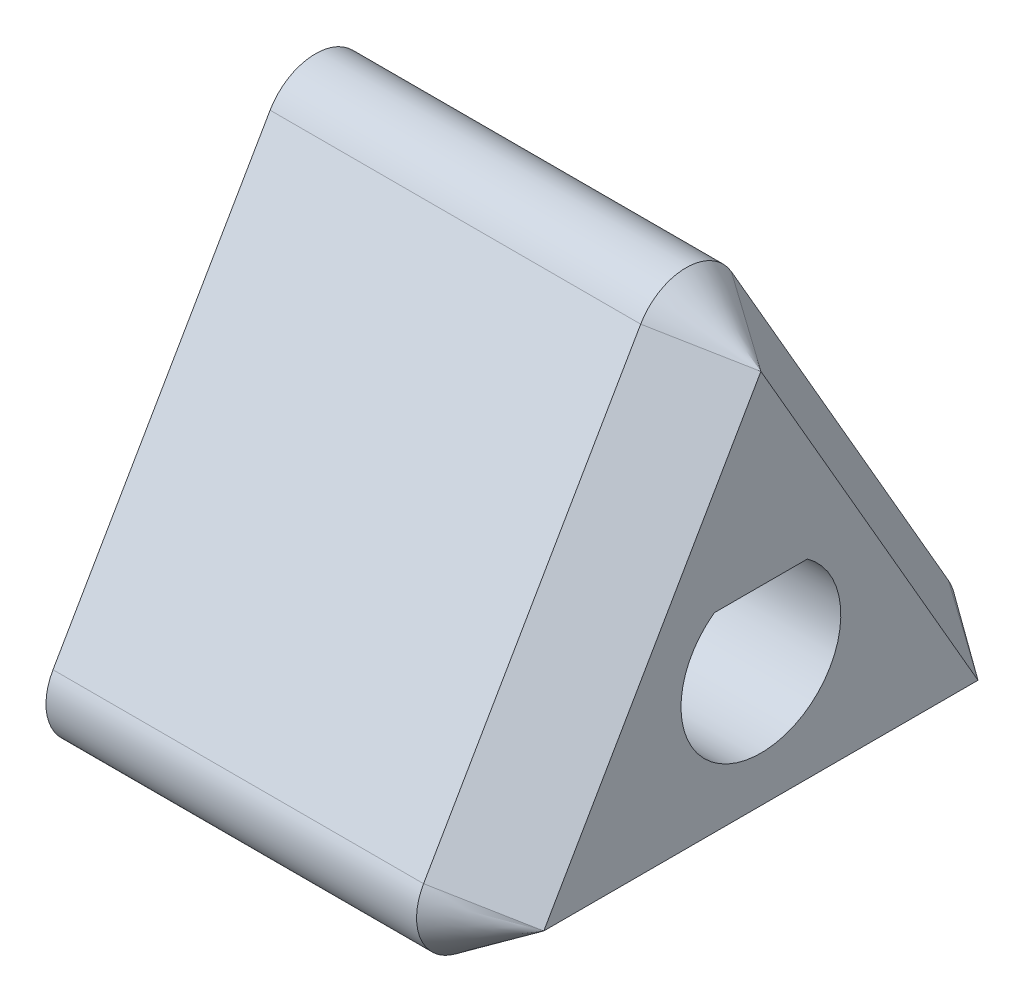
ISO-10303-21;
HEADER;
FILE_DESCRIPTION(('STEP AP214'),'2;1');
FILE_NAME('part.step','',(''),(''),'','','');
FILE_SCHEMA(('AUTOMOTIVE_DESIGN { 1 0 10303 214 1 1 1 1 }'));
ENDSEC;
DATA;
#1=APPLICATION_CONTEXT('core data for automotive mechanical design processes');
#2=APPLICATION_PROTOCOL_DEFINITION('international standard','automotive_design',2000,#1);
#3=PRODUCT_CONTEXT('',#1,'mechanical');
#4=PRODUCT('Part','Part','',(#3));
#5=PRODUCT_RELATED_PRODUCT_CATEGORY('part','',(#4));
#6=PRODUCT_DEFINITION_FORMATION('','',#4);
#7=PRODUCT_DEFINITION_CONTEXT('part definition',#1,'design');
#8=PRODUCT_DEFINITION('design','',#6,#7);
#9=PRODUCT_DEFINITION_SHAPE('','',#8);
#10=(LENGTH_UNIT() NAMED_UNIT(*) SI_UNIT(.MILLI.,.METRE.));
#11=(NAMED_UNIT(*) PLANE_ANGLE_UNIT() SI_UNIT($,.RADIAN.));
#12=(NAMED_UNIT(*) SI_UNIT($,.STERADIAN.) SOLID_ANGLE_UNIT());
#13=UNCERTAINTY_MEASURE_WITH_UNIT(LENGTH_MEASURE(1.E-05),#10,'distance_accuracy_value','');
#14=(GEOMETRIC_REPRESENTATION_CONTEXT(3) GLOBAL_UNCERTAINTY_ASSIGNED_CONTEXT((#13)) GLOBAL_UNIT_ASSIGNED_CONTEXT((#10,
#11,#12)) REPRESENTATION_CONTEXT('',''));
#15=CARTESIAN_POINT('',(0.,0.,0.));
#16=DIRECTION('',(0.,0.,1.));
#17=DIRECTION('',(1.,0.,0.));
#18=AXIS2_PLACEMENT_3D('',#15,#16,#17);
#19=CARTESIAN_POINT('',(17.,-6.78386566297798,-11.75));
#20=DIRECTION('',(0.,-0.500000000000004,0.866025403784436));
#21=DIRECTION('',(0.,-0.866025403784436,-0.500000000000004));
#22=AXIS2_PLACEMENT_3D('',#19,#20,#21);
#23=PLANE('',#22);
#24=DIRECTION('',(-1.,0.,0.));
#25=VECTOR('',#24,1.);
#26=CARTESIAN_POINT('',(17.,10.5677313259562,-1.73205080756889));
#27=LINE('',#26,#25);
#28=CARTESIAN_POINT('',(0.,10.5677313259562,-1.73205080756889));
#29=VERTEX_POINT('',#28);
#30=CARTESIAN_POINT('',(14.1437039865158,10.5677313259562,-1.73205080756889));
#31=VERTEX_POINT('',#30);
#32=EDGE_CURVE('E162',#29,#31,#27,.F.);
#33=ORIENTED_EDGE('',*,*,#32,.T.);
#34=DIRECTION('',(0.,-0.866025403784436,-0.500000000000004));
#35=VECTOR('',#34,1.);
#36=CARTESIAN_POINT('',(14.1437039865158,-3.783865662978,-10.0179491924312));
#37=LINE('',#36,#35);
#38=CARTESIAN_POINT('',(14.1437039865158,-3.783865662978,-10.0179491924312));
#39=VERTEX_POINT('',#38);
#40=EDGE_CURVE('E177',#31,#39,#37,.T.);
#41=ORIENTED_EDGE('',*,*,#40,.T.);
#42=DIRECTION('',(-1.,0.,0.));
#43=VECTOR('',#42,1.);
#44=CARTESIAN_POINT('',(17.,-3.783865662978,-10.0179491924312));
#45=LINE('',#44,#43);
#46=CARTESIAN_POINT('',(0.,-3.783865662978,-10.0179491924312));
#47=VERTEX_POINT('',#46);
#48=EDGE_CURVE('E165',#39,#47,#45,.T.);
#49=ORIENTED_EDGE('',*,*,#48,.T.);
#50=DIRECTION('',(0.,0.866025403784436,0.500000000000004));
#51=VECTOR('',#50,1.);
#52=CARTESIAN_POINT('',(0.,-6.78386566297798,-11.75));
#53=LINE('',#52,#51);
#54=EDGE_CURVE('E137',#47,#29,#53,.T.);
#55=ORIENTED_EDGE('',*,*,#54,.T.);
#56=EDGE_LOOP('',(#33,#41,#49,#55));
#57=FACE_BOUND('',#56,.T.);
#58=ADVANCED_FACE('F37',(#57),#23,.F.);
#59=CARTESIAN_POINT('',(17.,13.5677313259562,0.));
#60=DIRECTION('',(0.,-0.499999999999998,-0.86602540378444));
#61=DIRECTION('',(0.,0.86602540378444,-0.499999999999998));
#62=AXIS2_PLACEMENT_3D('',#59,#60,#61);
#63=PLANE('',#62);
#64=DIRECTION('',(-1.,0.,0.));
#65=VECTOR('',#64,1.);
#66=CARTESIAN_POINT('',(17.,-3.78386566297812,10.0179491924311));
#67=LINE('',#66,#65);
#68=CARTESIAN_POINT('',(0.,-3.78386566297813,10.0179491924311));
#69=VERTEX_POINT('',#68);
#70=CARTESIAN_POINT('',(14.1437039865158,-3.78386566297812,10.0179491924311));
#71=VERTEX_POINT('',#70);
#72=EDGE_CURVE('E160',#69,#71,#67,.F.);
#73=ORIENTED_EDGE('',*,*,#72,.T.);
#74=DIRECTION('',(0.,0.86602540378444,-0.499999999999998));
#75=VECTOR('',#74,1.);
#76=CARTESIAN_POINT('',(14.1437039865158,10.5677313259562,1.73205080756886));
#77=LINE('',#76,#75);
#78=CARTESIAN_POINT('',(14.1437039865158,10.5677313259562,1.73205080756887));
#79=VERTEX_POINT('',#78);
#80=EDGE_CURVE('E11',#71,#79,#77,.T.);
#81=ORIENTED_EDGE('',*,*,#80,.T.);
#82=DIRECTION('',(-1.,0.,0.));
#83=VECTOR('',#82,1.);
#84=CARTESIAN_POINT('',(17.,10.5677313259562,1.73205080756887));
#85=LINE('',#84,#83);
#86=CARTESIAN_POINT('',(0.,10.5677313259562,1.73205080756886));
#87=VERTEX_POINT('',#86);
#88=EDGE_CURVE('E158',#79,#87,#85,.T.);
#89=ORIENTED_EDGE('',*,*,#88,.T.);
#90=DIRECTION('',(0.,-0.86602540378444,0.499999999999998));
#91=VECTOR('',#90,1.);
#92=CARTESIAN_POINT('',(0.,13.5677313259562,0.));
#93=LINE('',#92,#91);
#94=EDGE_CURVE('E141',#87,#69,#93,.T.);
#95=ORIENTED_EDGE('',*,*,#94,.T.);
#96=EDGE_LOOP('',(#73,#81,#89,#95));
#97=FACE_BOUND('',#96,.T.);
#98=ADVANCED_FACE('F220',(#97),#63,.F.);
#99=CARTESIAN_POINT('',(17.,-6.78386566297815,11.75));
#100=DIRECTION('',(0.,1.,0.));
#101=DIRECTION('',(0.,0.,1.));
#102=AXIS2_PLACEMENT_3D('',#99,#100,#101);
#103=PLANE('',#102);
#104=DIRECTION('',(-1.,0.,0.));
#105=VECTOR('',#104,1.);
#106=CARTESIAN_POINT('',(17.,-6.78386566297801,-8.2858983848623));
#107=LINE('',#106,#105);
#108=CARTESIAN_POINT('',(0.,-6.78386566297801,-8.2858983848623));
#109=VERTEX_POINT('',#108);
#110=CARTESIAN_POINT('',(14.1437039865158,-6.78386566297801,-8.2858983848623));
#111=VERTEX_POINT('',#110);
#112=EDGE_CURVE('E147',#109,#111,#107,.F.);
#113=ORIENTED_EDGE('',*,*,#112,.T.);
#114=DIRECTION('',(0.,0.,1.));
#115=VECTOR('',#114,1.);
#116=CARTESIAN_POINT('',(14.1437039865158,-6.78386566297812,8.28589838486218));
#117=LINE('',#116,#115);
#118=CARTESIAN_POINT('',(14.1437039865158,-6.78386566297812,8.28589838486218));
#119=VERTEX_POINT('',#118);
#120=EDGE_CURVE('E179',#111,#119,#117,.T.);
#121=ORIENTED_EDGE('',*,*,#120,.T.);
#122=DIRECTION('',(-1.,0.,0.));
#123=VECTOR('',#122,1.);
#124=CARTESIAN_POINT('',(17.,-6.78386566297812,8.28589838486218));
#125=LINE('',#124,#123);
#126=CARTESIAN_POINT('',(0.,-6.78386566297812,8.28589838486218));
#127=VERTEX_POINT('',#126);
#128=EDGE_CURVE('E150',#119,#127,#125,.T.);
#129=ORIENTED_EDGE('',*,*,#128,.T.);
#130=DIRECTION('',(0.,0.,-1.));
#131=VECTOR('',#130,1.);
#132=CARTESIAN_POINT('',(0.,-6.78386566297815,11.75));
#133=LINE('',#132,#131);
#134=EDGE_CURVE('E144',#127,#109,#133,.T.);
#135=ORIENTED_EDGE('',*,*,#134,.T.);
#136=EDGE_LOOP('',(#113,#121,#129,#135));
#137=FACE_BOUND('',#136,.T.);
#138=ADVANCED_FACE('F224',(#137),#103,.F.);
#139=CARTESIAN_POINT('',(17.,0.,0.));
#140=DIRECTION('',(1.,0.,0.));
#141=DIRECTION('',(0.,0.,-1.));
#142=AXIS2_PLACEMENT_3D('',#139,#140,#141);
#143=PLANE('',#142);
#144=DIRECTION('',(0.,0.,-1.));
#145=VECTOR('',#144,1.);
#146=CARTESIAN_POINT('',(17.,-4.783865662978,-8.28589838486229));
#147=LINE('',#146,#145);
#148=CARTESIAN_POINT('',(17.,-4.78386566297812,8.28589838486219));
#149=VERTEX_POINT('',#148);
#150=CARTESIAN_POINT('',(17.,-4.783865662978,-8.28589838486229));
#151=VERTEX_POINT('',#150);
#152=EDGE_CURVE('E172',#149,#151,#147,.T.);
#153=ORIENTED_EDGE('',*,*,#152,.T.);
#154=DIRECTION('',(0.,0.866025403784437,0.500000000000004));
#155=VECTOR('',#154,1.);
#156=CARTESIAN_POINT('',(17.,9.5677313259562,0.));
#157=LINE('',#156,#155);
#158=CARTESIAN_POINT('',(17.,9.5677313259562,0.));
#159=VERTEX_POINT('',#158);
#160=EDGE_CURVE('E174',#151,#159,#157,.T.);
#161=ORIENTED_EDGE('',*,*,#160,.T.);
#162=DIRECTION('',(0.,-0.86602540378444,0.499999999999998));
#163=VECTOR('',#162,1.);
#164=CARTESIAN_POINT('',(17.,-4.78386566297813,8.28589838486219));
#165=LINE('',#164,#163);
#166=EDGE_CURVE('E170',#159,#149,#165,.T.);
#167=ORIENTED_EDGE('',*,*,#166,.T.);
#168=EDGE_LOOP('',(#153,#161,#167));
#169=FACE_BOUND('',#168,.T.);
#170=CARTESIAN_POINT('',(17.,0.,0.));
#171=DIRECTION('',(1.,0.,0.));
#172=DIRECTION('',(0.,0.,-1.));
#173=AXIS2_PLACEMENT_3D('',#170,#171,#172);
#174=CIRCLE('',#173,3.05);
#175=CARTESIAN_POINT('',(17.,2.48,1.77541544433972));
#176=VERTEX_POINT('',#175);
#177=CARTESIAN_POINT('',(17.,2.48,-1.77541544433972));
#178=VERTEX_POINT('',#177);
#179=EDGE_CURVE('E119',#176,#178,#174,.T.);
#180=ORIENTED_EDGE('',*,*,#179,.F.);
#181=DIRECTION('',(0.,0.,1.));
#182=VECTOR('',#181,1.);
#183=CARTESIAN_POINT('',(17.,2.48,-1.77541544433972));
#184=LINE('',#183,#182);
#185=EDGE_CURVE('E132',#178,#176,#184,.T.);
#186=ORIENTED_EDGE('',*,*,#185,.F.);
#187=EDGE_LOOP('',(#180,#186));
#188=FACE_BOUND('',#187,.T.);
#189=ADVANCED_FACE('F239',(#169,#188),#143,.T.);
#190=CARTESIAN_POINT('',(0.,0.,0.));
#191=DIRECTION('',(1.,0.,0.));
#192=DIRECTION('',(0.,0.,-1.));
#193=AXIS2_PLACEMENT_3D('',#190,#191,#192);
#194=PLANE('',#193);
#195=DIRECTION('',(0.,0.,1.));
#196=VECTOR('',#195,1.);
#197=CARTESIAN_POINT('',(0.,2.48,-1.77541544433972));
#198=LINE('',#197,#196);
#199=CARTESIAN_POINT('',(0.,2.48,-1.77541544433972));
#200=VERTEX_POINT('',#199);
#201=CARTESIAN_POINT('',(0.,2.48,1.77541544433972));
#202=VERTEX_POINT('',#201);
#203=EDGE_CURVE('E124',#200,#202,#198,.T.);
#204=ORIENTED_EDGE('',*,*,#203,.T.);
#205=CARTESIAN_POINT('',(0.,0.,0.));
#206=DIRECTION('',(1.,0.,0.));
#207=DIRECTION('',(0.,0.,-1.));
#208=AXIS2_PLACEMENT_3D('',#205,#206,#207);
#209=CIRCLE('',#208,3.05);
#210=EDGE_CURVE('E116',#202,#200,#209,.T.);
#211=ORIENTED_EDGE('',*,*,#210,.T.);
#212=EDGE_LOOP('',(#204,#211));
#213=FACE_BOUND('',#212,.T.);
#214=ORIENTED_EDGE('',*,*,#134,.F.);
#215=CARTESIAN_POINT('',(0.,-4.78386566297812,8.28589838486219));
#216=DIRECTION('',(1.,0.,0.));
#217=DIRECTION('',(0.,0.,-1.));
#218=AXIS2_PLACEMENT_3D('',#215,#216,#217);
#219=CIRCLE('',#218,2.);
#220=EDGE_CURVE('E156',#127,#69,#219,.F.);
#221=ORIENTED_EDGE('',*,*,#220,.T.);
#222=ORIENTED_EDGE('',*,*,#94,.F.);
#223=CARTESIAN_POINT('',(0.,9.5677313259562,0.));
#224=DIRECTION('',(1.,0.,0.));
#225=DIRECTION('',(0.,0.,-1.));
#226=AXIS2_PLACEMENT_3D('',#223,#224,#225);
#227=CIRCLE('',#226,2.);
#228=EDGE_CURVE('E152',#87,#29,#227,.F.);
#229=ORIENTED_EDGE('',*,*,#228,.T.);
#230=ORIENTED_EDGE('',*,*,#54,.F.);
#231=CARTESIAN_POINT('',(0.,-4.78386566297801,-8.28589838486229));
#232=DIRECTION('',(1.,0.,0.));
#233=DIRECTION('',(0.,0.,-1.));
#234=AXIS2_PLACEMENT_3D('',#231,#232,#233);
#235=CIRCLE('',#234,2.);
#236=EDGE_CURVE('E154',#47,#109,#235,.F.);
#237=ORIENTED_EDGE('',*,*,#236,.T.);
#238=EDGE_LOOP('',(#214,#221,#222,#229,#230,#237));
#239=FACE_BOUND('',#238,.T.);
#240=ADVANCED_FACE('F130',(#213,#239),#194,.F.);
#241=CARTESIAN_POINT('',(0.,0.,0.));
#242=DIRECTION('',(1.,0.,0.));
#243=DIRECTION('',(0.,0.,-1.));
#244=AXIS2_PLACEMENT_3D('',#241,#242,#243);
#245=CYLINDRICAL_SURFACE('',#244,3.05);
#246=ORIENTED_EDGE('',*,*,#179,.T.);
#247=DIRECTION('',(1.,0.,0.));
#248=VECTOR('',#247,1.);
#249=CARTESIAN_POINT('',(0.,2.48,-1.77541544433972));
#250=LINE('',#249,#248);
#251=EDGE_CURVE('E112',#200,#178,#250,.T.);
#252=ORIENTED_EDGE('',*,*,#251,.F.);
#253=ORIENTED_EDGE('',*,*,#210,.F.);
#254=DIRECTION('',(1.,0.,0.));
#255=VECTOR('',#254,1.);
#256=CARTESIAN_POINT('',(0.,2.48,1.77541544433972));
#257=LINE('',#256,#255);
#258=EDGE_CURVE('E123',#202,#176,#257,.T.);
#259=ORIENTED_EDGE('',*,*,#258,.T.);
#260=EDGE_LOOP('',(#246,#252,#253,#259));
#261=FACE_BOUND('',#260,.T.);
#262=ADVANCED_FACE('F114',(#261),#245,.F.);
#263=CARTESIAN_POINT('',(0.,2.48,-1.77541544433972));
#264=DIRECTION('',(0.,1.,0.));
#265=DIRECTION('',(0.,0.,1.));
#266=AXIS2_PLACEMENT_3D('',#263,#264,#265);
#267=PLANE('',#266);
#268=ORIENTED_EDGE('',*,*,#185,.T.);
#269=ORIENTED_EDGE('',*,*,#258,.F.);
#270=ORIENTED_EDGE('',*,*,#203,.F.);
#271=ORIENTED_EDGE('',*,*,#251,.T.);
#272=EDGE_LOOP('',(#268,#269,#270,#271));
#273=FACE_BOUND('',#272,.T.);
#274=ADVANCED_FACE('F127',(#273),#267,.F.);
#275=CARTESIAN_POINT('',(17.,-4.78386566297812,8.28589838486219));
#276=DIRECTION('',(-1.,0.,0.));
#277=DIRECTION('',(0.,0.,1.));
#278=AXIS2_PLACEMENT_3D('',#275,#276,#277);
#279=CYLINDRICAL_SURFACE('',#278,2.);
#280=ORIENTED_EDGE('',*,*,#128,.F.);
#281=CARTESIAN_POINT('',(14.1437039865158,-4.78386566297812,8.28589838486219));
#282=DIRECTION('',(1.,0.,0.));
#283=DIRECTION('',(0.,0.,-1.));
#284=AXIS2_PLACEMENT_3D('',#281,#282,#283);
#285=CIRCLE('',#284,2.);
#286=EDGE_CURVE('E47',#119,#71,#285,.F.);
#287=ORIENTED_EDGE('',*,*,#286,.T.);
#288=ORIENTED_EDGE('',*,*,#72,.F.);
#289=ORIENTED_EDGE('',*,*,#220,.F.);
#290=EDGE_LOOP('',(#280,#287,#288,#289));
#291=FACE_BOUND('',#290,.T.);
#292=ADVANCED_FACE('F221',(#291),#279,.T.);
#293=CARTESIAN_POINT('',(17.,-4.78386566297801,-8.28589838486229));
#294=DIRECTION('',(-1.,0.,0.));
#295=DIRECTION('',(0.,0.,1.));
#296=AXIS2_PLACEMENT_3D('',#293,#294,#295);
#297=CYLINDRICAL_SURFACE('',#296,2.);
#298=ORIENTED_EDGE('',*,*,#48,.F.);
#299=CARTESIAN_POINT('',(14.1437039865158,-4.78386566297801,-8.28589838486229));
#300=DIRECTION('',(1.,0.,0.));
#301=DIRECTION('',(0.,0.,-1.));
#302=AXIS2_PLACEMENT_3D('',#299,#300,#301);
#303=CIRCLE('',#302,2.);
#304=EDGE_CURVE('E167',#39,#111,#303,.F.);
#305=ORIENTED_EDGE('',*,*,#304,.T.);
#306=ORIENTED_EDGE('',*,*,#112,.F.);
#307=ORIENTED_EDGE('',*,*,#236,.F.);
#308=EDGE_LOOP('',(#298,#305,#306,#307));
#309=FACE_BOUND('',#308,.T.);
#310=ADVANCED_FACE('F226',(#309),#297,.T.);
#311=CARTESIAN_POINT('',(17.,9.5677313259562,0.));
#312=DIRECTION('',(-1.,0.,0.));
#313=DIRECTION('',(0.,0.,1.));
#314=AXIS2_PLACEMENT_3D('',#311,#312,#313);
#315=CYLINDRICAL_SURFACE('',#314,2.);
#316=ORIENTED_EDGE('',*,*,#88,.F.);
#317=CARTESIAN_POINT('',(14.1437039865158,9.5677313259562,0.));
#318=DIRECTION('',(1.,0.,0.));
#319=DIRECTION('',(0.,0.,-1.));
#320=AXIS2_PLACEMENT_3D('',#317,#318,#319);
#321=CIRCLE('',#320,2.);
#322=EDGE_CURVE('E181',#79,#31,#321,.F.);
#323=ORIENTED_EDGE('',*,*,#322,.T.);
#324=ORIENTED_EDGE('',*,*,#32,.F.);
#325=ORIENTED_EDGE('',*,*,#228,.F.);
#326=EDGE_LOOP('',(#316,#323,#324,#325));
#327=FACE_BOUND('',#326,.T.);
#328=ADVANCED_FACE('F211',(#327),#315,.T.);
#329=CARTESIAN_POINT('',(17.,2.39193283148902,4.14294919243109));
#330=DIRECTION('',(0.573576436351047,0.409576022144494,0.709406479916223));
#331=DIRECTION('',(0.,0.86602540378444,-0.499999999999998));
#332=AXIS2_PLACEMENT_3D('',#329,#330,#331);
#333=PLANE('',#332);
#334=DIRECTION('',(0.819152044288991,-0.286788218175522,-0.496731764892155));
#335=VECTOR('',#334,1.);
#336=CARTESIAN_POINT('',(14.1437039865158,10.5677313259562,1.73205080756887));
#337=LINE('',#336,#335);
#338=EDGE_CURVE('E193',#79,#159,#337,.T.);
#339=ORIENTED_EDGE('',*,*,#338,.F.);
#340=ORIENTED_EDGE('',*,*,#80,.F.);
#341=DIRECTION('',(-0.819152044288991,0.286788218175523,0.496731764892155));
#342=VECTOR('',#341,1.);
#343=CARTESIAN_POINT('',(17.,-4.78386566297812,8.28589838486219));
#344=LINE('',#343,#342);
#345=EDGE_CURVE('E42',#149,#71,#344,.T.);
#346=ORIENTED_EDGE('',*,*,#345,.F.);
#347=ORIENTED_EDGE('',*,*,#166,.F.);
#348=EDGE_LOOP('',(#339,#340,#346,#347));
#349=FACE_BOUND('',#348,.T.);
#350=ADVANCED_FACE('F40',(#349),#333,.T.);
#351=CARTESIAN_POINT('',(14.1437039865158,-4.78386566297812,8.28589838486219));
#352=DIRECTION('',(-1.,0.,0.));
#353=DIRECTION('',(0.,0.,1.));
#354=AXIS2_PLACEMENT_3D('',#351,#352,#353);
#355=CONICAL_SURFACE('',#354,2.,0.610865238198016);
#356=ORIENTED_EDGE('',*,*,#345,.T.);
#357=ORIENTED_EDGE('',*,*,#286,.F.);
#358=DIRECTION('',(-0.819152044288991,-0.573576436351047,0.));
#359=VECTOR('',#358,1.);
#360=CARTESIAN_POINT('',(17.,-4.78386566297812,8.28589838486219));
#361=LINE('',#360,#359);
#362=EDGE_CURVE('E191',#149,#119,#361,.T.);
#363=ORIENTED_EDGE('',*,*,#362,.F.);
#364=EDGE_LOOP('',(#356,#357,#363));
#365=FACE_BOUND('',#364,.T.);
#366=ADVANCED_FACE('F204',(#365),#355,.T.);
#367=CARTESIAN_POINT('',(14.1437039865158,9.5677313259562,0.));
#368=DIRECTION('',(-1.,0.,0.));
#369=DIRECTION('',(0.,0.,1.));
#370=AXIS2_PLACEMENT_3D('',#367,#368,#369);
#371=CONICAL_SURFACE('',#370,2.,0.610865238198016);
#372=ORIENTED_EDGE('',*,*,#322,.F.);
#373=ORIENTED_EDGE('',*,*,#338,.T.);
#374=DIRECTION('',(0.819152044288991,-0.286788218175526,0.496731764892153));
#375=VECTOR('',#374,1.);
#376=CARTESIAN_POINT('',(14.1437039865158,10.5677313259562,-1.73205080756889));
#377=LINE('',#376,#375);
#378=EDGE_CURVE('E189',#31,#159,#377,.T.);
#379=ORIENTED_EDGE('',*,*,#378,.F.);
#380=EDGE_LOOP('',(#372,#373,#379));
#381=FACE_BOUND('',#380,.T.);
#382=ADVANCED_FACE('F207',(#381),#371,.T.);
#383=CARTESIAN_POINT('',(17.,-4.78386566297806,0.));
#384=DIRECTION('',(0.573576436351047,-0.819152044288991,0.));
#385=DIRECTION('',(0.,0.,1.));
#386=AXIS2_PLACEMENT_3D('',#383,#384,#385);
#387=PLANE('',#386);
#388=ORIENTED_EDGE('',*,*,#362,.T.);
#389=ORIENTED_EDGE('',*,*,#120,.F.);
#390=DIRECTION('',(-0.819152044288991,-0.573576436351047,0.));
#391=VECTOR('',#390,1.);
#392=CARTESIAN_POINT('',(17.,-4.783865662978,-8.28589838486229));
#393=LINE('',#392,#391);
#394=EDGE_CURVE('E187',#151,#111,#393,.T.);
#395=ORIENTED_EDGE('',*,*,#394,.F.);
#396=ORIENTED_EDGE('',*,*,#152,.F.);
#397=EDGE_LOOP('',(#388,#389,#395,#396));
#398=FACE_BOUND('',#397,.T.);
#399=ADVANCED_FACE('F238',(#398),#387,.T.);
#400=CARTESIAN_POINT('',(17.,2.39193283148909,-4.14294919243115));
#401=DIRECTION('',(0.573576436351047,0.409576022144499,-0.70940647991622));
#402=DIRECTION('',(0.,-0.866025403784436,-0.500000000000004));
#403=AXIS2_PLACEMENT_3D('',#400,#401,#402);
#404=PLANE('',#403);
#405=ORIENTED_EDGE('',*,*,#378,.T.);
#406=ORIENTED_EDGE('',*,*,#160,.F.);
#407=DIRECTION('',(0.819152044288991,-0.286788218175526,0.496731764892154));
#408=VECTOR('',#407,1.);
#409=CARTESIAN_POINT('',(14.1437039865158,-3.783865662978,-10.0179491924312));
#410=LINE('',#409,#408);
#411=EDGE_CURVE('E184',#39,#151,#410,.T.);
#412=ORIENTED_EDGE('',*,*,#411,.F.);
#413=ORIENTED_EDGE('',*,*,#40,.F.);
#414=EDGE_LOOP('',(#405,#406,#412,#413));
#415=FACE_BOUND('',#414,.T.);
#416=ADVANCED_FACE('F235',(#415),#404,.T.);
#417=CARTESIAN_POINT('',(14.1437039865158,-4.78386566297801,-8.28589838486229));
#418=DIRECTION('',(-1.,0.,0.));
#419=DIRECTION('',(0.,0.,1.));
#420=AXIS2_PLACEMENT_3D('',#417,#418,#419);
#421=CONICAL_SURFACE('',#420,2.,0.610865238198016);
#422=ORIENTED_EDGE('',*,*,#394,.T.);
#423=ORIENTED_EDGE('',*,*,#304,.F.);
#424=ORIENTED_EDGE('',*,*,#411,.T.);
#425=EDGE_LOOP('',(#422,#423,#424));
#426=FACE_BOUND('',#425,.T.);
#427=ADVANCED_FACE('F230',(#426),#421,.T.);
#428=CLOSED_SHELL('',(#58,#98,#138,#189,#240,#262,#274,#292,#310,#328,#350,#366,#382,#399,#416,#427));
#429=MANIFOLD_SOLID_BREP('B2',#428);
#430=ADVANCED_BREP_SHAPE_REPRESENTATION('',(#18,#429),#14);
#431=SHAPE_DEFINITION_REPRESENTATION(#9,#430);
ENDSEC;
END-ISO-10303-21;
